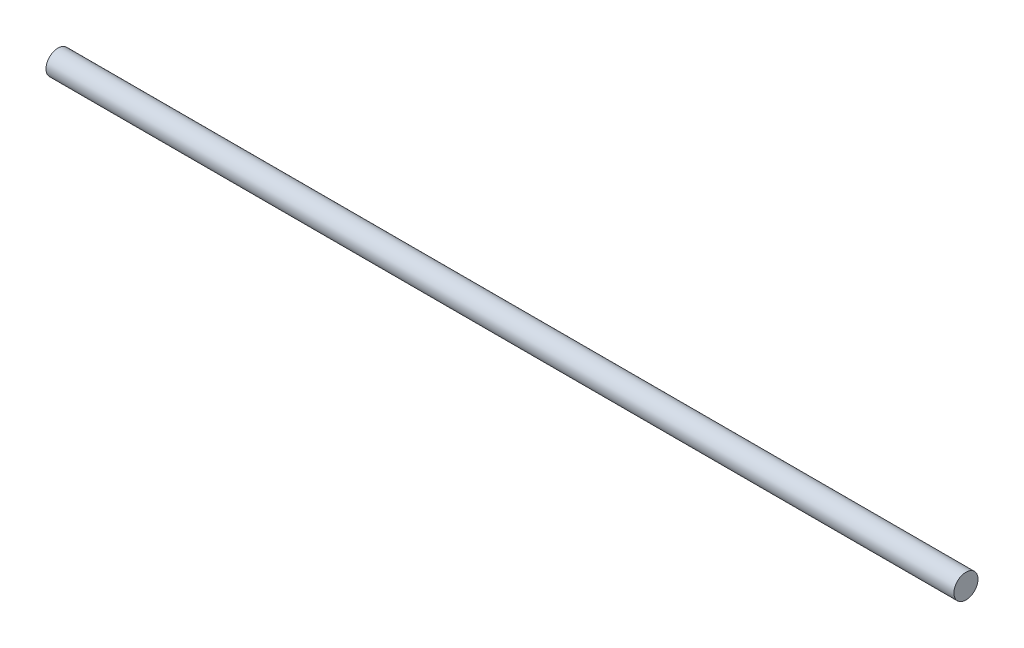
ISO-10303-21;
HEADER;
FILE_DESCRIPTION(('STEP AP214'),'2;1');
FILE_NAME('part.step','',(''),(''),'','','');
FILE_SCHEMA(('AUTOMOTIVE_DESIGN { 1 0 10303 214 1 1 1 1 }'));
ENDSEC;
DATA;
#1=APPLICATION_CONTEXT('core data for automotive mechanical design processes');
#2=APPLICATION_PROTOCOL_DEFINITION('international standard','automotive_design',2000,#1);
#3=PRODUCT_CONTEXT('',#1,'mechanical');
#4=PRODUCT('Part','Part','',(#3));
#5=PRODUCT_RELATED_PRODUCT_CATEGORY('part','',(#4));
#6=PRODUCT_DEFINITION_FORMATION('','',#4);
#7=PRODUCT_DEFINITION_CONTEXT('part definition',#1,'design');
#8=PRODUCT_DEFINITION('design','',#6,#7);
#9=PRODUCT_DEFINITION_SHAPE('','',#8);
#10=(LENGTH_UNIT() NAMED_UNIT(*) SI_UNIT(.MILLI.,.METRE.));
#11=(NAMED_UNIT(*) PLANE_ANGLE_UNIT() SI_UNIT($,.RADIAN.));
#12=(NAMED_UNIT(*) SI_UNIT($,.STERADIAN.) SOLID_ANGLE_UNIT());
#13=UNCERTAINTY_MEASURE_WITH_UNIT(LENGTH_MEASURE(1.E-05),#10,'distance_accuracy_value','');
#14=(GEOMETRIC_REPRESENTATION_CONTEXT(3) GLOBAL_UNCERTAINTY_ASSIGNED_CONTEXT((#13)) GLOBAL_UNIT_ASSIGNED_CONTEXT((#10,
#11,#12)) REPRESENTATION_CONTEXT('',''));
#15=CARTESIAN_POINT('',(0.,0.,0.));
#16=DIRECTION('',(0.,0.,1.));
#17=DIRECTION('',(1.,0.,0.));
#18=AXIS2_PLACEMENT_3D('',#15,#16,#17);
#19=CARTESIAN_POINT('',(150.,0.,0.));
#20=DIRECTION('',(-1.,0.,0.));
#21=DIRECTION('',(0.,0.,1.));
#22=AXIS2_PLACEMENT_3D('',#19,#20,#21);
#23=CYLINDRICAL_SURFACE('',#22,3.985);
#24=CARTESIAN_POINT('',(150.,0.,0.));
#25=DIRECTION('',(1.,0.,0.));
#26=DIRECTION('',(0.,0.,-1.));
#27=AXIS2_PLACEMENT_3D('',#24,#25,#26);
#28=CIRCLE('',#27,3.985);
#29=CARTESIAN_POINT('',(150.,0.,-3.985));
#30=VERTEX_POINT('',#29);
#31=EDGE_CURVE('E10',#30,#30,#28,.T.);
#32=ORIENTED_EDGE('',*,*,#31,.F.);
#33=EDGE_LOOP('',(#32));
#34=FACE_BOUND('',#33,.T.);
#35=CARTESIAN_POINT('',(-150.,0.,0.));
#36=DIRECTION('',(1.,0.,0.));
#37=DIRECTION('',(0.,0.,-1.));
#38=AXIS2_PLACEMENT_3D('',#35,#36,#37);
#39=CIRCLE('',#38,3.985);
#40=CARTESIAN_POINT('',(-150.,0.,-3.985));
#41=VERTEX_POINT('',#40);
#42=EDGE_CURVE('E40',#41,#41,#39,.T.);
#43=ORIENTED_EDGE('',*,*,#42,.T.);
#44=EDGE_LOOP('',(#43));
#45=FACE_BOUND('',#44,.T.);
#46=ADVANCED_FACE('F37',(#34,#45),#23,.T.);
#47=CARTESIAN_POINT('',(150.,0.,0.));
#48=DIRECTION('',(1.,0.,0.));
#49=DIRECTION('',(0.,0.,-1.));
#50=AXIS2_PLACEMENT_3D('',#47,#48,#49);
#51=PLANE('',#50);
#52=ORIENTED_EDGE('',*,*,#31,.T.);
#53=EDGE_LOOP('',(#52));
#54=FACE_BOUND('',#53,.T.);
#55=ADVANCED_FACE('F52',(#54),#51,.T.);
#56=CARTESIAN_POINT('',(-150.,0.,0.));
#57=DIRECTION('',(1.,0.,0.));
#58=DIRECTION('',(0.,0.,-1.));
#59=AXIS2_PLACEMENT_3D('',#56,#57,#58);
#60=PLANE('',#59);
#61=ORIENTED_EDGE('',*,*,#42,.F.);
#62=EDGE_LOOP('',(#61));
#63=FACE_BOUND('',#62,.T.);
#64=ADVANCED_FACE('F50',(#63),#60,.F.);
#65=CLOSED_SHELL('',(#46,#55,#64));
#66=MANIFOLD_SOLID_BREP('B2',#65);
#67=ADVANCED_BREP_SHAPE_REPRESENTATION('',(#18,#66),#14);
#68=SHAPE_DEFINITION_REPRESENTATION(#9,#67);
ENDSEC;
END-ISO-10303-21;
